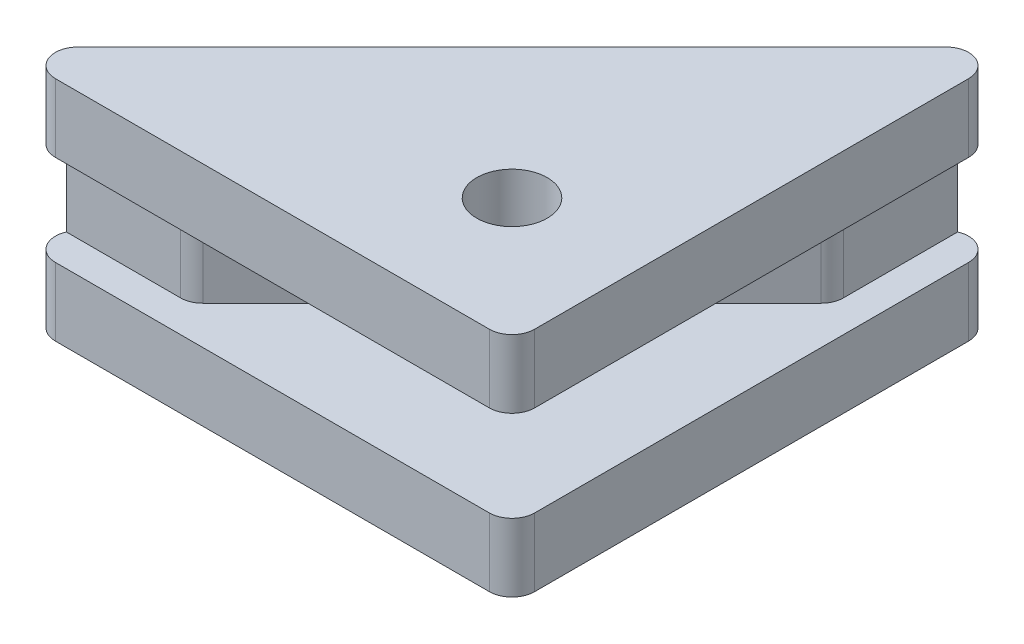
ISO-10303-21;
HEADER;
FILE_DESCRIPTION(('STEP AP214'),'2;1');
FILE_NAME('part.step','',(''),(''),'','','');
FILE_SCHEMA(('AUTOMOTIVE_DESIGN { 1 0 10303 214 1 1 1 1 }'));
ENDSEC;
DATA;
#1=APPLICATION_CONTEXT('core data for automotive mechanical design processes');
#2=APPLICATION_PROTOCOL_DEFINITION('international standard','automotive_design',2000,#1);
#3=PRODUCT_CONTEXT('',#1,'mechanical');
#4=PRODUCT('Part','Part','',(#3));
#5=PRODUCT_RELATED_PRODUCT_CATEGORY('part','',(#4));
#6=PRODUCT_DEFINITION_FORMATION('','',#4);
#7=PRODUCT_DEFINITION_CONTEXT('part definition',#1,'design');
#8=PRODUCT_DEFINITION('design','',#6,#7);
#9=PRODUCT_DEFINITION_SHAPE('','',#8);
#10=(LENGTH_UNIT() NAMED_UNIT(*) SI_UNIT(.MILLI.,.METRE.));
#11=(NAMED_UNIT(*) PLANE_ANGLE_UNIT() SI_UNIT($,.RADIAN.));
#12=(NAMED_UNIT(*) SI_UNIT($,.STERADIAN.) SOLID_ANGLE_UNIT());
#13=UNCERTAINTY_MEASURE_WITH_UNIT(LENGTH_MEASURE(1.E-05),#10,'distance_accuracy_value','');
#14=(GEOMETRIC_REPRESENTATION_CONTEXT(3) GLOBAL_UNCERTAINTY_ASSIGNED_CONTEXT((#13)) GLOBAL_UNIT_ASSIGNED_CONTEXT((#10,
#11,#12)) REPRESENTATION_CONTEXT('',''));
#15=CARTESIAN_POINT('',(0.,0.,0.));
#16=DIRECTION('',(0.,0.,1.));
#17=DIRECTION('',(1.,0.,0.));
#18=AXIS2_PLACEMENT_3D('',#15,#16,#17);
#19=CARTESIAN_POINT('',(0.,0.,0.));
#20=DIRECTION('',(0.,1.,0.));
#21=DIRECTION('',(0.,0.,1.));
#22=AXIS2_PLACEMENT_3D('',#19,#20,#21);
#23=PLANE('',#22);
#24=CARTESIAN_POINT('',(-11.,0.,-11.));
#25=DIRECTION('',(0.,1.,0.));
#26=DIRECTION('',(0.,0.,1.));
#27=AXIS2_PLACEMENT_3D('',#24,#25,#26);
#28=CIRCLE('',#27,3.1);
#29=CARTESIAN_POINT('',(-11.,0.,-7.9));
#30=VERTEX_POINT('',#29);
#31=EDGE_CURVE('E209',#30,#30,#28,.T.);
#32=ORIENTED_EDGE('',*,*,#31,.T.);
#33=EDGE_LOOP('',(#32));
#34=FACE_BOUND('',#33,.T.);
#35=DIRECTION('',(0.,0.,-1.));
#36=VECTOR('',#35,1.);
#37=CARTESIAN_POINT('',(0.,0.,0.));
#38=LINE('',#37,#36);
#39=CARTESIAN_POINT('',(0.,0.,-2.));
#40=VERTEX_POINT('',#39);
#41=CARTESIAN_POINT('',(0.,0.,-40.1715728752538));
#42=VERTEX_POINT('',#41);
#43=EDGE_CURVE('E178',#40,#42,#38,.T.);
#44=ORIENTED_EDGE('',*,*,#43,.F.);
#45=CARTESIAN_POINT('',(-2.,0.,-2.));
#46=DIRECTION('',(0.,1.,0.));
#47=DIRECTION('',(0.,0.,1.));
#48=AXIS2_PLACEMENT_3D('',#45,#46,#47);
#49=CIRCLE('',#48,2.);
#50=CARTESIAN_POINT('',(-2.,0.,0.));
#51=VERTEX_POINT('',#50);
#52=EDGE_CURVE('E160',#40,#51,#49,.F.);
#53=ORIENTED_EDGE('',*,*,#52,.T.);
#54=DIRECTION('',(1.,0.,0.));
#55=VECTOR('',#54,1.);
#56=CARTESIAN_POINT('',(0.,0.,0.));
#57=LINE('',#56,#55);
#58=CARTESIAN_POINT('',(-40.1715728752538,0.,0.));
#59=VERTEX_POINT('',#58);
#60=EDGE_CURVE('E189',#59,#51,#57,.T.);
#61=ORIENTED_EDGE('',*,*,#60,.F.);
#62=CARTESIAN_POINT('',(-40.1715728752538,0.,-2.));
#63=DIRECTION('',(0.,1.,0.));
#64=DIRECTION('',(0.,0.,1.));
#65=AXIS2_PLACEMENT_3D('',#62,#63,#64);
#66=CIRCLE('',#65,2.);
#67=CARTESIAN_POINT('',(-42.0046031532361,0.,-2.80000000000001));
#68=VERTEX_POINT('',#67);
#69=EDGE_CURVE('E183',#59,#68,#66,.F.);
#70=ORIENTED_EDGE('',*,*,#69,.T.);
#71=DIRECTION('',(-1.,0.,0.));
#72=VECTOR('',#71,1.);
#73=CARTESIAN_POINT('',(-31.1411254969543,0.,-2.8));
#74=LINE('',#73,#72);
#75=CARTESIAN_POINT('',(-31.9695526217005,0.,-2.8));
#76=VERTEX_POINT('',#75);
#77=EDGE_CURVE('E322',#76,#68,#74,.T.);
#78=ORIENTED_EDGE('',*,*,#77,.F.);
#79=CARTESIAN_POINT('',(-31.9695526217005,0.,-4.8));
#80=DIRECTION('',(0.,1.,0.));
#81=DIRECTION('',(0.,0.,1.));
#82=AXIS2_PLACEMENT_3D('',#79,#80,#81);
#83=CIRCLE('',#82,2.);
#84=CARTESIAN_POINT('',(-30.5553390593274,0.,-3.38578643762692));
#85=VERTEX_POINT('',#84);
#86=EDGE_CURVE('E285',#76,#85,#83,.T.);
#87=ORIENTED_EDGE('',*,*,#86,.T.);
#88=DIRECTION('',(-0.707106781186548,0.,0.707106781186547));
#89=VECTOR('',#88,1.);
#90=CARTESIAN_POINT('',(-2.8,0.,-31.1411254969543));
#91=LINE('',#90,#89);
#92=CARTESIAN_POINT('',(-3.38578643762691,0.,-30.5553390593274));
#93=VERTEX_POINT('',#92);
#94=EDGE_CURVE('E295',#93,#85,#91,.T.);
#95=ORIENTED_EDGE('',*,*,#94,.F.);
#96=CARTESIAN_POINT('',(-4.8,0.,-31.9695526217005));
#97=DIRECTION('',(0.,1.,0.));
#98=DIRECTION('',(0.,0.,1.));
#99=AXIS2_PLACEMENT_3D('',#96,#97,#98);
#100=CIRCLE('',#99,2.);
#101=CARTESIAN_POINT('',(-2.8,0.,-31.9695526217005));
#102=VERTEX_POINT('',#101);
#103=EDGE_CURVE('E54',#93,#102,#100,.T.);
#104=ORIENTED_EDGE('',*,*,#103,.T.);
#105=DIRECTION('',(0.,0.,1.));
#106=VECTOR('',#105,1.);
#107=CARTESIAN_POINT('',(-2.8,0.,-42.2));
#108=LINE('',#107,#106);
#109=CARTESIAN_POINT('',(-2.8,0.,-42.0046031532361));
#110=VERTEX_POINT('',#109);
#111=EDGE_CURVE('E293',#110,#102,#108,.T.);
#112=ORIENTED_EDGE('',*,*,#111,.F.);
#113=CARTESIAN_POINT('',(-2.,0.,-40.1715728752538));
#114=DIRECTION('',(0.,1.,0.));
#115=DIRECTION('',(0.,0.,1.));
#116=AXIS2_PLACEMENT_3D('',#113,#114,#115);
#117=CIRCLE('',#116,2.);
#118=EDGE_CURVE('E172',#110,#42,#117,.F.);
#119=ORIENTED_EDGE('',*,*,#118,.T.);
#120=EDGE_LOOP('',(#44,#53,#61,#70,#78,#87,#95,#104,#112,#119));
#121=FACE_BOUND('',#120,.T.);
#122=ADVANCED_FACE('F45',(#34,#121),#23,.F.);
#123=CARTESIAN_POINT('',(0.,6.,0.));
#124=DIRECTION('',(-1.,0.,0.));
#125=DIRECTION('',(0.,0.,1.));
#126=AXIS2_PLACEMENT_3D('',#123,#124,#125);
#127=PLANE('',#126);
#128=DIRECTION('',(0.,0.,-1.));
#129=VECTOR('',#128,1.);
#130=CARTESIAN_POINT('',(0.,6.,0.));
#131=LINE('',#130,#129);
#132=CARTESIAN_POINT('',(0.,6.,-2.));
#133=VERTEX_POINT('',#132);
#134=CARTESIAN_POINT('',(0.,6.,-40.1715728752538));
#135=VERTEX_POINT('',#134);
#136=EDGE_CURVE('E181',#133,#135,#131,.T.);
#137=ORIENTED_EDGE('',*,*,#136,.F.);
#138=DIRECTION('',(0.,-1.,0.));
#139=VECTOR('',#138,1.);
#140=CARTESIAN_POINT('',(0.,6.,-2.));
#141=LINE('',#140,#139);
#142=EDGE_CURVE('E164',#133,#40,#141,.T.);
#143=ORIENTED_EDGE('',*,*,#142,.T.);
#144=ORIENTED_EDGE('',*,*,#43,.T.);
#145=DIRECTION('',(0.,1.,0.));
#146=VECTOR('',#145,1.);
#147=CARTESIAN_POINT('',(0.,3.,-40.1715728752538));
#148=LINE('',#147,#146);
#149=EDGE_CURVE('E184',#42,#135,#148,.T.);
#150=ORIENTED_EDGE('',*,*,#149,.T.);
#151=EDGE_LOOP('',(#137,#143,#144,#150));
#152=FACE_BOUND('',#151,.T.);
#153=ADVANCED_FACE('F177',(#152),#127,.F.);
#154=CARTESIAN_POINT('',(0.,6.,-45.));
#155=DIRECTION('',(0.707106781186548,0.,0.707106781186547));
#156=DIRECTION('',(0.707106781186547,0.,-0.707106781186548));
#157=AXIS2_PLACEMENT_3D('',#154,#155,#156);
#158=PLANE('',#157);
#159=DIRECTION('',(-0.707106781186548,0.,0.707106781186548));
#160=VECTOR('',#159,1.);
#161=CARTESIAN_POINT('',(0.,6.,-45.));
#162=LINE('',#161,#160);
#163=CARTESIAN_POINT('',(-3.4142135623731,6.,-41.5857864376269));
#164=VERTEX_POINT('',#163);
#165=CARTESIAN_POINT('',(-41.5857864376269,6.,-3.41421356237308));
#166=VERTEX_POINT('',#165);
#167=EDGE_CURVE('E332',#164,#166,#162,.T.);
#168=ORIENTED_EDGE('',*,*,#167,.F.);
#169=DIRECTION('',(0.,1.,0.));
#170=VECTOR('',#169,1.);
#171=CARTESIAN_POINT('',(-3.4142135623731,6.,-41.5857864376269));
#172=LINE('',#171,#170);
#173=CARTESIAN_POINT('',(-3.4142135623731,-14.,-41.5857864376269));
#174=VERTEX_POINT('',#173);
#175=EDGE_CURVE('E61',#164,#174,#172,.F.);
#176=ORIENTED_EDGE('',*,*,#175,.T.);
#177=DIRECTION('',(0.707106781186547,0.,-0.707106781186548));
#178=VECTOR('',#177,1.);
#179=CARTESIAN_POINT('',(-22.5,-14.,-22.5));
#180=LINE('',#179,#178);
#181=CARTESIAN_POINT('',(-41.5857864376269,-14.,-3.41421356237309));
#182=VERTEX_POINT('',#181);
#183=EDGE_CURVE('E368',#182,#174,#180,.T.);
#184=ORIENTED_EDGE('',*,*,#183,.F.);
#185=DIRECTION('',(0.,-1.,0.));
#186=VECTOR('',#185,1.);
#187=CARTESIAN_POINT('',(-41.5857864376269,6.,-3.4142135623731));
#188=LINE('',#187,#186);
#189=EDGE_CURVE('E281',#182,#166,#188,.F.);
#190=ORIENTED_EDGE('',*,*,#189,.T.);
#191=EDGE_LOOP('',(#168,#176,#184,#190));
#192=FACE_BOUND('',#191,.T.);
#193=ADVANCED_FACE('F399',(#192),#158,.F.);
#194=CARTESIAN_POINT('',(0.,6.,0.));
#195=DIRECTION('',(0.,0.,-1.));
#196=DIRECTION('',(-1.,0.,0.));
#197=AXIS2_PLACEMENT_3D('',#194,#195,#196);
#198=PLANE('',#197);
#199=ORIENTED_EDGE('',*,*,#60,.T.);
#200=DIRECTION('',(0.,-1.,0.));
#201=VECTOR('',#200,1.);
#202=CARTESIAN_POINT('',(-2.,6.,0.));
#203=LINE('',#202,#201);
#204=CARTESIAN_POINT('',(-2.,6.,0.));
#205=VERTEX_POINT('',#204);
#206=EDGE_CURVE('E165',#51,#205,#203,.F.);
#207=ORIENTED_EDGE('',*,*,#206,.T.);
#208=DIRECTION('',(1.,0.,0.));
#209=VECTOR('',#208,1.);
#210=CARTESIAN_POINT('',(0.,6.,0.));
#211=LINE('',#210,#209);
#212=CARTESIAN_POINT('',(-40.1715728752538,6.,0.));
#213=VERTEX_POINT('',#212);
#214=EDGE_CURVE('E201',#213,#205,#211,.T.);
#215=ORIENTED_EDGE('',*,*,#214,.F.);
#216=DIRECTION('',(0.,-1.,0.));
#217=VECTOR('',#216,1.);
#218=CARTESIAN_POINT('',(-40.1715728752538,6.,0.));
#219=LINE('',#218,#217);
#220=EDGE_CURVE('E171',#213,#59,#219,.T.);
#221=ORIENTED_EDGE('',*,*,#220,.T.);
#222=EDGE_LOOP('',(#199,#207,#215,#221));
#223=FACE_BOUND('',#222,.T.);
#224=ADVANCED_FACE('F343',(#223),#198,.F.);
#225=CARTESIAN_POINT('',(0.,6.,0.));
#226=DIRECTION('',(0.,1.,0.));
#227=DIRECTION('',(0.,0.,1.));
#228=AXIS2_PLACEMENT_3D('',#225,#226,#227);
#229=PLANE('',#228);
#230=CARTESIAN_POINT('',(-11.,6.,-11.));
#231=DIRECTION('',(0.,1.,0.));
#232=DIRECTION('',(0.,0.,1.));
#233=AXIS2_PLACEMENT_3D('',#230,#231,#232);
#234=CIRCLE('',#233,3.1);
#235=CARTESIAN_POINT('',(-11.,6.,-7.9));
#236=VERTEX_POINT('',#235);
#237=EDGE_CURVE('E385',#236,#236,#234,.T.);
#238=ORIENTED_EDGE('',*,*,#237,.F.);
#239=EDGE_LOOP('',(#238));
#240=FACE_BOUND('',#239,.T.);
#241=ORIENTED_EDGE('',*,*,#214,.T.);
#242=CARTESIAN_POINT('',(-2.,6.,-2.));
#243=DIRECTION('',(0.,1.,0.));
#244=DIRECTION('',(0.,0.,1.));
#245=AXIS2_PLACEMENT_3D('',#242,#243,#244);
#246=CIRCLE('',#245,2.);
#247=EDGE_CURVE('E227',#205,#133,#246,.T.);
#248=ORIENTED_EDGE('',*,*,#247,.T.);
#249=ORIENTED_EDGE('',*,*,#136,.T.);
#250=CARTESIAN_POINT('',(-2.,6.,-40.1715728752538));
#251=DIRECTION('',(0.,1.,0.));
#252=DIRECTION('',(0.,0.,1.));
#253=AXIS2_PLACEMENT_3D('',#250,#251,#252);
#254=CIRCLE('',#253,2.);
#255=EDGE_CURVE('E224',#135,#164,#254,.T.);
#256=ORIENTED_EDGE('',*,*,#255,.T.);
#257=ORIENTED_EDGE('',*,*,#167,.T.);
#258=CARTESIAN_POINT('',(-40.1715728752538,6.,-2.));
#259=DIRECTION('',(0.,1.,0.));
#260=DIRECTION('',(0.,0.,1.));
#261=AXIS2_PLACEMENT_3D('',#258,#259,#260);
#262=CIRCLE('',#261,2.);
#263=EDGE_CURVE('E221',#166,#213,#262,.T.);
#264=ORIENTED_EDGE('',*,*,#263,.T.);
#265=EDGE_LOOP('',(#241,#248,#249,#256,#257,#264));
#266=FACE_BOUND('',#265,.T.);
#267=ADVANCED_FACE('F340',(#240,#266),#229,.T.);
#268=CARTESIAN_POINT('',(-2.8,-8.,-42.2));
#269=DIRECTION('',(-1.,0.,0.));
#270=DIRECTION('',(0.,0.,1.));
#271=AXIS2_PLACEMENT_3D('',#268,#269,#270);
#272=PLANE('',#271);
#273=ORIENTED_EDGE('',*,*,#111,.T.);
#274=DIRECTION('',(0.,1.,0.));
#275=VECTOR('',#274,1.);
#276=CARTESIAN_POINT('',(-2.8,-8.,-31.9695526217005));
#277=LINE('',#276,#275);
#278=CARTESIAN_POINT('',(-2.8,-8.,-31.9695526217005));
#279=VERTEX_POINT('',#278);
#280=EDGE_CURVE('E278',#102,#279,#277,.F.);
#281=ORIENTED_EDGE('',*,*,#280,.T.);
#282=DIRECTION('',(0.,0.,1.));
#283=VECTOR('',#282,1.);
#284=CARTESIAN_POINT('',(-2.8,-8.,-42.2));
#285=LINE('',#284,#283);
#286=CARTESIAN_POINT('',(-2.8,-8.,-42.0046031532361));
#287=VERTEX_POINT('',#286);
#288=EDGE_CURVE('E315',#287,#279,#285,.T.);
#289=ORIENTED_EDGE('',*,*,#288,.F.);
#290=DIRECTION('',(0.,1.,0.));
#291=VECTOR('',#290,1.);
#292=CARTESIAN_POINT('',(-2.8,-8.,-42.0046031532361));
#293=LINE('',#292,#291);
#294=EDGE_CURVE('E275',#287,#110,#293,.T.);
#295=ORIENTED_EDGE('',*,*,#294,.T.);
#296=EDGE_LOOP('',(#273,#281,#289,#295));
#297=FACE_BOUND('',#296,.T.);
#298=ADVANCED_FACE('F300',(#297),#272,.F.);
#299=CARTESIAN_POINT('',(-2.8,-8.,-31.1411254969543));
#300=DIRECTION('',(-0.707106781186547,0.,-0.707106781186548));
#301=DIRECTION('',(-0.707106781186548,0.,0.707106781186547));
#302=AXIS2_PLACEMENT_3D('',#299,#300,#301);
#303=PLANE('',#302);
#304=ORIENTED_EDGE('',*,*,#94,.T.);
#305=DIRECTION('',(0.,1.,0.));
#306=VECTOR('',#305,1.);
#307=CARTESIAN_POINT('',(-30.5553390593274,-8.,-3.38578643762691));
#308=LINE('',#307,#306);
#309=CARTESIAN_POINT('',(-30.5553390593274,-8.,-3.38578643762692));
#310=VERTEX_POINT('',#309);
#311=EDGE_CURVE('E272',#85,#310,#308,.F.);
#312=ORIENTED_EDGE('',*,*,#311,.T.);
#313=DIRECTION('',(-0.707106781186548,0.,0.707106781186547));
#314=VECTOR('',#313,1.);
#315=CARTESIAN_POINT('',(-2.8,-8.,-31.1411254969543));
#316=LINE('',#315,#314);
#317=CARTESIAN_POINT('',(-3.38578643762691,-8.,-30.5553390593274));
#318=VERTEX_POINT('',#317);
#319=EDGE_CURVE('E198',#318,#310,#316,.T.);
#320=ORIENTED_EDGE('',*,*,#319,.F.);
#321=DIRECTION('',(0.,1.,0.));
#322=VECTOR('',#321,1.);
#323=CARTESIAN_POINT('',(-3.38578643762691,-8.,-30.5553390593274));
#324=LINE('',#323,#322);
#325=EDGE_CURVE('E268',#318,#93,#324,.T.);
#326=ORIENTED_EDGE('',*,*,#325,.T.);
#327=EDGE_LOOP('',(#304,#312,#320,#326));
#328=FACE_BOUND('',#327,.T.);
#329=ADVANCED_FACE('F317',(#328),#303,.F.);
#330=CARTESIAN_POINT('',(-31.1411254969543,-8.,-2.8));
#331=DIRECTION('',(0.,0.,-1.));
#332=DIRECTION('',(-1.,0.,0.));
#333=AXIS2_PLACEMENT_3D('',#330,#331,#332);
#334=PLANE('',#333);
#335=DIRECTION('',(-1.,0.,0.));
#336=VECTOR('',#335,1.);
#337=CARTESIAN_POINT('',(-31.1411254969543,-8.,-2.8));
#338=LINE('',#337,#336);
#339=CARTESIAN_POINT('',(-31.9695526217005,-8.,-2.8));
#340=VERTEX_POINT('',#339);
#341=CARTESIAN_POINT('',(-42.0046031532361,-8.,-2.8));
#342=VERTEX_POINT('',#341);
#343=EDGE_CURVE('E190',#340,#342,#338,.T.);
#344=ORIENTED_EDGE('',*,*,#343,.F.);
#345=DIRECTION('',(0.,1.,0.));
#346=VECTOR('',#345,1.);
#347=CARTESIAN_POINT('',(-31.9695526217005,-8.,-2.8));
#348=LINE('',#347,#346);
#349=EDGE_CURVE('E264',#340,#76,#348,.T.);
#350=ORIENTED_EDGE('',*,*,#349,.T.);
#351=ORIENTED_EDGE('',*,*,#77,.T.);
#352=DIRECTION('',(0.,-1.,0.));
#353=VECTOR('',#352,1.);
#354=CARTESIAN_POINT('',(-42.0046031532361,0.,-2.8));
#355=LINE('',#354,#353);
#356=EDGE_CURVE('E261',#68,#342,#355,.T.);
#357=ORIENTED_EDGE('',*,*,#356,.T.);
#358=EDGE_LOOP('',(#344,#350,#351,#357));
#359=FACE_BOUND('',#358,.T.);
#360=ADVANCED_FACE('F351',(#359),#334,.F.);
#361=CARTESIAN_POINT('',(0.,-8.,0.));
#362=DIRECTION('',(0.,-1.,0.));
#363=DIRECTION('',(0.,0.,-1.));
#364=AXIS2_PLACEMENT_3D('',#361,#362,#363);
#365=PLANE('',#364);
#366=CARTESIAN_POINT('',(-13.,-8.,-13.));
#367=DIRECTION('',(0.,-1.,0.));
#368=DIRECTION('',(0.,0.,-1.));
#369=AXIS2_PLACEMENT_3D('',#366,#367,#368);
#370=CIRCLE('',#369,2.75);
#371=CARTESIAN_POINT('',(-13.,-8.,-10.25));
#372=VERTEX_POINT('',#371);
#373=EDGE_CURVE('E208',#372,#372,#370,.F.);
#374=ORIENTED_EDGE('',*,*,#373,.F.);
#375=EDGE_LOOP('',(#374));
#376=FACE_BOUND('',#375,.T.);
#377=DIRECTION('',(-1.,0.,0.));
#378=VECTOR('',#377,1.);
#379=CARTESIAN_POINT('',(0.,-8.,0.));
#380=LINE('',#379,#378);
#381=CARTESIAN_POINT('',(-2.,-8.,0.));
#382=VERTEX_POINT('',#381);
#383=CARTESIAN_POINT('',(-40.1715728752538,-8.,0.));
#384=VERTEX_POINT('',#383);
#385=EDGE_CURVE('E361',#382,#384,#380,.T.);
#386=ORIENTED_EDGE('',*,*,#385,.F.);
#387=CARTESIAN_POINT('',(-2.,-8.,-2.));
#388=DIRECTION('',(0.,-1.,0.));
#389=DIRECTION('',(0.,0.,-1.));
#390=AXIS2_PLACEMENT_3D('',#387,#388,#389);
#391=CIRCLE('',#390,2.);
#392=CARTESIAN_POINT('',(0.,-8.,-2.));
#393=VERTEX_POINT('',#392);
#394=EDGE_CURVE('E243',#382,#393,#391,.F.);
#395=ORIENTED_EDGE('',*,*,#394,.T.);
#396=DIRECTION('',(0.,0.,1.));
#397=VECTOR('',#396,1.);
#398=CARTESIAN_POINT('',(0.,-8.,0.));
#399=LINE('',#398,#397);
#400=CARTESIAN_POINT('',(0.,-8.,-40.1715728752538));
#401=VERTEX_POINT('',#400);
#402=EDGE_CURVE('E372',#401,#393,#399,.T.);
#403=ORIENTED_EDGE('',*,*,#402,.F.);
#404=CARTESIAN_POINT('',(-2.,-8.,-40.1715728752538));
#405=DIRECTION('',(0.,-1.,0.));
#406=DIRECTION('',(0.,0.,-1.));
#407=AXIS2_PLACEMENT_3D('',#404,#405,#406);
#408=CIRCLE('',#407,2.);
#409=EDGE_CURVE('E240',#401,#287,#408,.F.);
#410=ORIENTED_EDGE('',*,*,#409,.T.);
#411=ORIENTED_EDGE('',*,*,#288,.T.);
#412=CARTESIAN_POINT('',(-4.8,-8.,-31.9695526217005));
#413=DIRECTION('',(0.,-1.,0.));
#414=DIRECTION('',(0.,0.,-1.));
#415=AXIS2_PLACEMENT_3D('',#412,#413,#414);
#416=CIRCLE('',#415,2.);
#417=EDGE_CURVE('E11',#279,#318,#416,.T.);
#418=ORIENTED_EDGE('',*,*,#417,.T.);
#419=ORIENTED_EDGE('',*,*,#319,.T.);
#420=CARTESIAN_POINT('',(-31.9695526217005,-8.,-4.8));
#421=DIRECTION('',(0.,-1.,0.));
#422=DIRECTION('',(0.,0.,-1.));
#423=AXIS2_PLACEMENT_3D('',#420,#421,#422);
#424=CIRCLE('',#423,2.);
#425=EDGE_CURVE('E288',#310,#340,#424,.T.);
#426=ORIENTED_EDGE('',*,*,#425,.T.);
#427=ORIENTED_EDGE('',*,*,#343,.T.);
#428=CARTESIAN_POINT('',(-40.1715728752538,-8.,-2.));
#429=DIRECTION('',(0.,-1.,0.));
#430=DIRECTION('',(0.,0.,-1.));
#431=AXIS2_PLACEMENT_3D('',#428,#429,#430);
#432=CIRCLE('',#431,2.);
#433=EDGE_CURVE('E237',#342,#384,#432,.F.);
#434=ORIENTED_EDGE('',*,*,#433,.T.);
#435=EDGE_LOOP('',(#386,#395,#403,#410,#411,#418,#419,#426,#427,#434));
#436=FACE_BOUND('',#435,.T.);
#437=ADVANCED_FACE('F313',(#376,#436),#365,.F.);
#438=CARTESIAN_POINT('',(0.,-14.,0.));
#439=DIRECTION('',(-1.,0.,0.));
#440=DIRECTION('',(0.,0.,1.));
#441=AXIS2_PLACEMENT_3D('',#438,#439,#440);
#442=PLANE('',#441);
#443=ORIENTED_EDGE('',*,*,#402,.T.);
#444=DIRECTION('',(0.,1.,0.));
#445=VECTOR('',#444,1.);
#446=CARTESIAN_POINT('',(0.,-14.,-2.));
#447=LINE('',#446,#445);
#448=CARTESIAN_POINT('',(0.,-14.,-2.));
#449=VERTEX_POINT('',#448);
#450=EDGE_CURVE('E250',#393,#449,#447,.F.);
#451=ORIENTED_EDGE('',*,*,#450,.T.);
#452=DIRECTION('',(0.,0.,1.));
#453=VECTOR('',#452,1.);
#454=CARTESIAN_POINT('',(0.,-14.,0.));
#455=LINE('',#454,#453);
#456=CARTESIAN_POINT('',(0.,-14.,-40.1715728752538));
#457=VERTEX_POINT('',#456);
#458=EDGE_CURVE('E365',#457,#449,#455,.T.);
#459=ORIENTED_EDGE('',*,*,#458,.F.);
#460=DIRECTION('',(0.,1.,0.));
#461=VECTOR('',#460,1.);
#462=CARTESIAN_POINT('',(0.,-14.,-40.1715728752538));
#463=LINE('',#462,#461);
#464=EDGE_CURVE('E246',#457,#401,#463,.T.);
#465=ORIENTED_EDGE('',*,*,#464,.T.);
#466=EDGE_LOOP('',(#443,#451,#459,#465));
#467=FACE_BOUND('',#466,.T.);
#468=ADVANCED_FACE('F429',(#467),#442,.F.);
#469=CARTESIAN_POINT('',(0.,-14.,0.));
#470=DIRECTION('',(0.,0.,-1.));
#471=DIRECTION('',(-1.,0.,0.));
#472=AXIS2_PLACEMENT_3D('',#469,#470,#471);
#473=PLANE('',#472);
#474=DIRECTION('',(-1.,0.,0.));
#475=VECTOR('',#474,1.);
#476=CARTESIAN_POINT('',(0.,-14.,0.));
#477=LINE('',#476,#475);
#478=CARTESIAN_POINT('',(-2.,-14.,0.));
#479=VERTEX_POINT('',#478);
#480=CARTESIAN_POINT('',(-40.1715728752538,-14.,0.));
#481=VERTEX_POINT('',#480);
#482=EDGE_CURVE('E305',#479,#481,#477,.T.);
#483=ORIENTED_EDGE('',*,*,#482,.F.);
#484=DIRECTION('',(0.,1.,0.));
#485=VECTOR('',#484,1.);
#486=CARTESIAN_POINT('',(-2.,-14.,0.));
#487=LINE('',#486,#485);
#488=EDGE_CURVE('E233',#479,#382,#487,.T.);
#489=ORIENTED_EDGE('',*,*,#488,.T.);
#490=ORIENTED_EDGE('',*,*,#385,.T.);
#491=DIRECTION('',(0.,-1.,0.));
#492=VECTOR('',#491,1.);
#493=CARTESIAN_POINT('',(-40.1715728752538,-11.,0.));
#494=LINE('',#493,#492);
#495=EDGE_CURVE('E230',#384,#481,#494,.T.);
#496=ORIENTED_EDGE('',*,*,#495,.T.);
#497=EDGE_LOOP('',(#483,#489,#490,#496));
#498=FACE_BOUND('',#497,.T.);
#499=ADVANCED_FACE('F359',(#498),#473,.F.);
#500=CARTESIAN_POINT('',(0.,-14.,0.));
#501=DIRECTION('',(0.,-1.,0.));
#502=DIRECTION('',(0.,0.,-1.));
#503=AXIS2_PLACEMENT_3D('',#500,#501,#502);
#504=PLANE('',#503);
#505=CARTESIAN_POINT('',(-13.,-14.,-13.));
#506=DIRECTION('',(0.,-1.,0.));
#507=DIRECTION('',(0.,0.,-1.));
#508=AXIS2_PLACEMENT_3D('',#505,#506,#507);
#509=CIRCLE('',#508,2.75);
#510=CARTESIAN_POINT('',(-13.,-14.,-10.25));
#511=VERTEX_POINT('',#510);
#512=EDGE_CURVE('E204',#511,#511,#509,.F.);
#513=ORIENTED_EDGE('',*,*,#512,.T.);
#514=EDGE_LOOP('',(#513));
#515=FACE_BOUND('',#514,.T.);
#516=ORIENTED_EDGE('',*,*,#458,.T.);
#517=CARTESIAN_POINT('',(-2.,-14.,-2.));
#518=DIRECTION('',(0.,-1.,0.));
#519=DIRECTION('',(0.,0.,-1.));
#520=AXIS2_PLACEMENT_3D('',#517,#518,#519);
#521=CIRCLE('',#520,2.);
#522=EDGE_CURVE('E258',#449,#479,#521,.T.);
#523=ORIENTED_EDGE('',*,*,#522,.T.);
#524=ORIENTED_EDGE('',*,*,#482,.T.);
#525=CARTESIAN_POINT('',(-40.1715728752538,-14.,-2.));
#526=DIRECTION('',(0.,-1.,0.));
#527=DIRECTION('',(0.,0.,-1.));
#528=AXIS2_PLACEMENT_3D('',#525,#526,#527);
#529=CIRCLE('',#528,2.);
#530=EDGE_CURVE('E68',#481,#182,#529,.T.);
#531=ORIENTED_EDGE('',*,*,#530,.T.);
#532=ORIENTED_EDGE('',*,*,#183,.T.);
#533=CARTESIAN_POINT('',(-2.,-14.,-40.1715728752538));
#534=DIRECTION('',(0.,-1.,0.));
#535=DIRECTION('',(0.,0.,-1.));
#536=AXIS2_PLACEMENT_3D('',#533,#534,#535);
#537=CIRCLE('',#536,2.);
#538=EDGE_CURVE('E255',#174,#457,#537,.T.);
#539=ORIENTED_EDGE('',*,*,#538,.T.);
#540=EDGE_LOOP('',(#516,#523,#524,#531,#532,#539));
#541=FACE_BOUND('',#540,.T.);
#542=ADVANCED_FACE('F363',(#515,#541),#504,.T.);
#543=CARTESIAN_POINT('',(-13.,-14.000012,-13.));
#544=DIRECTION('',(0.,1.,0.));
#545=DIRECTION('',(0.,0.,1.));
#546=AXIS2_PLACEMENT_3D('',#543,#544,#545);
#547=CYLINDRICAL_SURFACE('',#546,2.75);
#548=CARTESIAN_POINT('',(-13.,-14.,-10.25));
#549=CARTESIAN_POINT('',(-13.,-13.9375,-10.25));
#550=CARTESIAN_POINT('',(-13.,-13.875,-10.25));
#551=CARTESIAN_POINT('',(-13.,-13.75,-10.25));
#552=CARTESIAN_POINT('',(-13.,-13.6875,-10.25));
#553=CARTESIAN_POINT('',(-13.,-13.5625,-10.25));
#554=CARTESIAN_POINT('',(-13.,-13.5,-10.25));
#555=CARTESIAN_POINT('',(-13.,-13.375,-10.25));
#556=CARTESIAN_POINT('',(-13.,-13.3125,-10.25));
#557=CARTESIAN_POINT('',(-13.,-13.1875,-10.25));
#558=CARTESIAN_POINT('',(-13.,-13.125,-10.25));
#559=CARTESIAN_POINT('',(-13.,-13.,-10.25));
#560=CARTESIAN_POINT('',(-13.,-12.9375,-10.25));
#561=CARTESIAN_POINT('',(-13.,-12.8125,-10.25));
#562=CARTESIAN_POINT('',(-13.,-12.75,-10.25));
#563=CARTESIAN_POINT('',(-13.,-12.625,-10.25));
#564=CARTESIAN_POINT('',(-13.,-12.5625,-10.25));
#565=CARTESIAN_POINT('',(-13.,-12.4375,-10.25));
#566=CARTESIAN_POINT('',(-13.,-12.375,-10.25));
#567=CARTESIAN_POINT('',(-13.,-12.25,-10.25));
#568=CARTESIAN_POINT('',(-13.,-12.1875,-10.25));
#569=CARTESIAN_POINT('',(-13.,-12.0625,-10.25));
#570=CARTESIAN_POINT('',(-13.,-12.,-10.25));
#571=CARTESIAN_POINT('',(-13.,-11.875,-10.25));
#572=CARTESIAN_POINT('',(-13.,-11.8125,-10.25));
#573=CARTESIAN_POINT('',(-13.,-11.6875,-10.25));
#574=CARTESIAN_POINT('',(-13.,-11.625,-10.25));
#575=CARTESIAN_POINT('',(-13.,-11.5,-10.25));
#576=CARTESIAN_POINT('',(-13.,-11.4375,-10.25));
#577=CARTESIAN_POINT('',(-13.,-11.3125,-10.25));
#578=CARTESIAN_POINT('',(-13.,-11.25,-10.25));
#579=CARTESIAN_POINT('',(-13.,-11.125,-10.25));
#580=CARTESIAN_POINT('',(-13.,-11.0625,-10.25));
#581=CARTESIAN_POINT('',(-13.,-10.9375,-10.25));
#582=CARTESIAN_POINT('',(-13.,-10.875,-10.25));
#583=CARTESIAN_POINT('',(-13.,-10.75,-10.25));
#584=CARTESIAN_POINT('',(-13.,-10.6875,-10.25));
#585=CARTESIAN_POINT('',(-13.,-10.5625,-10.25));
#586=CARTESIAN_POINT('',(-13.,-10.5,-10.25));
#587=CARTESIAN_POINT('',(-13.,-10.375,-10.25));
#588=CARTESIAN_POINT('',(-13.,-10.3125,-10.25));
#589=CARTESIAN_POINT('',(-13.,-10.1875,-10.25));
#590=CARTESIAN_POINT('',(-13.,-10.125,-10.25));
#591=CARTESIAN_POINT('',(-13.,-10.,-10.25));
#592=CARTESIAN_POINT('',(-13.,-9.9375,-10.25));
#593=CARTESIAN_POINT('',(-13.,-9.8125,-10.25));
#594=CARTESIAN_POINT('',(-13.,-9.75,-10.25));
#595=CARTESIAN_POINT('',(-13.,-9.625,-10.25));
#596=CARTESIAN_POINT('',(-13.,-9.5625,-10.25));
#597=CARTESIAN_POINT('',(-13.,-9.4375,-10.25));
#598=CARTESIAN_POINT('',(-13.,-9.375,-10.25));
#599=CARTESIAN_POINT('',(-13.,-9.25,-10.25));
#600=CARTESIAN_POINT('',(-13.,-9.1875,-10.25));
#601=CARTESIAN_POINT('',(-13.,-9.0625,-10.25));
#602=CARTESIAN_POINT('',(-13.,-9.,-10.25));
#603=CARTESIAN_POINT('',(-13.,-8.875,-10.25));
#604=CARTESIAN_POINT('',(-13.,-8.8125,-10.25));
#605=CARTESIAN_POINT('',(-13.,-8.6875,-10.25));
#606=CARTESIAN_POINT('',(-13.,-8.625,-10.25));
#607=CARTESIAN_POINT('',(-13.,-8.5,-10.25));
#608=CARTESIAN_POINT('',(-13.,-8.4375,-10.25));
#609=CARTESIAN_POINT('',(-13.,-8.3125,-10.25));
#610=CARTESIAN_POINT('',(-13.,-8.25,-10.25));
#611=CARTESIAN_POINT('',(-13.,-8.125,-10.25));
#612=CARTESIAN_POINT('',(-13.,-8.0625,-10.25));
#613=CARTESIAN_POINT('',(-13.,-8.,-10.25));
#614=B_SPLINE_CURVE_WITH_KNOTS('',3,(#548,#549,#550,#551,#552,#553,#554,#555,#556,#557,#558,
#559,#560,#561,#562,#563,#564,#565,#566,#567,#568,#569,#570,#571,#572,#573,#574,#575,#576,#577,
#578,#579,#580,#581,#582,#583,#584,#585,#586,#587,#588,#589,#590,#591,#592,#593,#594,#595,#596,
#597,#598,#599,#600,#601,#602,#603,#604,#605,#606,#607,#608,#609,#610,#611,#612,#613),
.UNSPECIFIED.,.F.,.F.,(4,2,2,2,2,2,2,2,2,2,2,2,2,2,2,2,2,2,2,2,2,2,2,2,2,2,2,2,2,2,2,2,4),(0.,
0.1875,0.375,0.5625,0.750000000000001,0.937500000000001,1.125,1.3125,1.5,1.6875,1.875,2.0625,
2.25,2.4375,2.625,2.8125,3.,3.1875,3.375,3.5625,3.75,3.9375,4.125,4.3125,4.5,4.6875,4.875,
5.0625,5.25,5.4375,5.625,5.8125,6.),.UNSPECIFIED.);
#615=EDGE_CURVE('BSEAM413',#511,#372,#614,.T.);
#616=ORIENTED_EDGE('',*,*,#512,.F.);
#617=ORIENTED_EDGE('',*,*,#373,.T.);
#618=ORIENTED_EDGE('',*,*,#615,.T.);
#619=ORIENTED_EDGE('',*,*,#615,.F.);
#620=EDGE_LOOP('',(#616,#618,#617,#619));
#621=FACE_BOUND('',#620,.T.);
#622=ADVANCED_FACE('F413',(#621),#547,.F.);
#623=CARTESIAN_POINT('',(-2.,6.,-2.));
#624=DIRECTION('',(0.,-1.,0.));
#625=DIRECTION('',(0.,0.,-1.));
#626=AXIS2_PLACEMENT_3D('',#623,#624,#625);
#627=CYLINDRICAL_SURFACE('',#626,2.);
#628=ORIENTED_EDGE('',*,*,#247,.F.);
#629=ORIENTED_EDGE('',*,*,#206,.F.);
#630=ORIENTED_EDGE('',*,*,#52,.F.);
#631=ORIENTED_EDGE('',*,*,#142,.F.);
#632=EDGE_LOOP('',(#628,#629,#630,#631));
#633=FACE_BOUND('',#632,.T.);
#634=ADVANCED_FACE('F163',(#633),#627,.T.);
#635=CARTESIAN_POINT('',(-2.,-14.,-2.));
#636=DIRECTION('',(0.,1.,0.));
#637=DIRECTION('',(0.,0.,1.));
#638=AXIS2_PLACEMENT_3D('',#635,#636,#637);
#639=CYLINDRICAL_SURFACE('',#638,2.);
#640=ORIENTED_EDGE('',*,*,#522,.F.);
#641=ORIENTED_EDGE('',*,*,#450,.F.);
#642=ORIENTED_EDGE('',*,*,#394,.F.);
#643=ORIENTED_EDGE('',*,*,#488,.F.);
#644=EDGE_LOOP('',(#640,#641,#642,#643));
#645=FACE_BOUND('',#644,.T.);
#646=ADVANCED_FACE('F412',(#645),#639,.T.);
#647=CARTESIAN_POINT('',(-31.9695526217005,-8.,-4.8));
#648=DIRECTION('',(0.,1.,0.));
#649=DIRECTION('',(0.,0.,1.));
#650=AXIS2_PLACEMENT_3D('',#647,#648,#649);
#651=CYLINDRICAL_SURFACE('',#650,2.);
#652=ORIENTED_EDGE('',*,*,#425,.F.);
#653=ORIENTED_EDGE('',*,*,#311,.F.);
#654=ORIENTED_EDGE('',*,*,#86,.F.);
#655=ORIENTED_EDGE('',*,*,#349,.F.);
#656=EDGE_LOOP('',(#652,#653,#654,#655));
#657=FACE_BOUND('',#656,.T.);
#658=ADVANCED_FACE('F354',(#657),#651,.T.);
#659=CARTESIAN_POINT('',(-4.8,-8.,-31.9695526217005));
#660=DIRECTION('',(0.,1.,0.));
#661=DIRECTION('',(0.,0.,1.));
#662=AXIS2_PLACEMENT_3D('',#659,#660,#661);
#663=CYLINDRICAL_SURFACE('',#662,2.);
#664=ORIENTED_EDGE('',*,*,#417,.F.);
#665=ORIENTED_EDGE('',*,*,#280,.F.);
#666=ORIENTED_EDGE('',*,*,#103,.F.);
#667=ORIENTED_EDGE('',*,*,#325,.F.);
#668=EDGE_LOOP('',(#664,#665,#666,#667));
#669=FACE_BOUND('',#668,.T.);
#670=ADVANCED_FACE('F308',(#669),#663,.T.);
#671=CARTESIAN_POINT('',(-2.,-14.,-40.1715728752538));
#672=DIRECTION('',(0.,1.,0.));
#673=DIRECTION('',(0.,0.,1.));
#674=AXIS2_PLACEMENT_3D('',#671,#672,#673);
#675=CYLINDRICAL_SURFACE('',#674,2.);
#676=ORIENTED_EDGE('',*,*,#538,.F.);
#677=ORIENTED_EDGE('',*,*,#175,.F.);
#678=ORIENTED_EDGE('',*,*,#255,.F.);
#679=ORIENTED_EDGE('',*,*,#149,.F.);
#680=ORIENTED_EDGE('',*,*,#118,.F.);
#681=ORIENTED_EDGE('',*,*,#294,.F.);
#682=ORIENTED_EDGE('',*,*,#409,.F.);
#683=ORIENTED_EDGE('',*,*,#464,.F.);
#684=EDGE_LOOP('',(#676,#677,#678,#679,#680,#681,#682,#683));
#685=FACE_BOUND('',#684,.T.);
#686=ADVANCED_FACE('F420',(#685),#675,.T.);
#687=CARTESIAN_POINT('',(-40.1715728752538,6.,-2.));
#688=DIRECTION('',(0.,-1.,0.));
#689=DIRECTION('',(0.,0.,-1.));
#690=AXIS2_PLACEMENT_3D('',#687,#688,#689);
#691=CYLINDRICAL_SURFACE('',#690,2.);
#692=ORIENTED_EDGE('',*,*,#263,.F.);
#693=ORIENTED_EDGE('',*,*,#189,.F.);
#694=ORIENTED_EDGE('',*,*,#530,.F.);
#695=ORIENTED_EDGE('',*,*,#495,.F.);
#696=ORIENTED_EDGE('',*,*,#433,.F.);
#697=ORIENTED_EDGE('',*,*,#356,.F.);
#698=ORIENTED_EDGE('',*,*,#69,.F.);
#699=ORIENTED_EDGE('',*,*,#220,.F.);
#700=EDGE_LOOP('',(#692,#693,#694,#695,#696,#697,#698,#699));
#701=FACE_BOUND('',#700,.T.);
#702=ADVANCED_FACE('F47',(#701),#691,.T.);
#703=CARTESIAN_POINT('',(-11.,-1.,-11.));
#704=DIRECTION('',(0.,1.,0.));
#705=DIRECTION('',(0.,0.,1.));
#706=AXIS2_PLACEMENT_3D('',#703,#704,#705);
#707=CYLINDRICAL_SURFACE('',#706,3.1);
#708=ORIENTED_EDGE('',*,*,#237,.T.);
#709=EDGE_LOOP('',(#708));
#710=FACE_BOUND('',#709,.T.);
#711=ORIENTED_EDGE('',*,*,#31,.F.);
#712=EDGE_LOOP('',(#711));
#713=FACE_BOUND('',#712,.T.);
#714=ADVANCED_FACE('F390',(#710,#713),#707,.F.);
#715=CLOSED_SHELL('',(#122,#153,#193,#224,#267,#298,#329,#360,#437,#468,#499,#542,#622,#634,
#646,#658,#670,#686,#702,#714));
#716=MANIFOLD_SOLID_BREP('B2',#715);
#717=ADVANCED_BREP_SHAPE_REPRESENTATION('',(#18,#716),#14);
#718=SHAPE_DEFINITION_REPRESENTATION(#9,#717);
ENDSEC;
END-ISO-10303-21;
